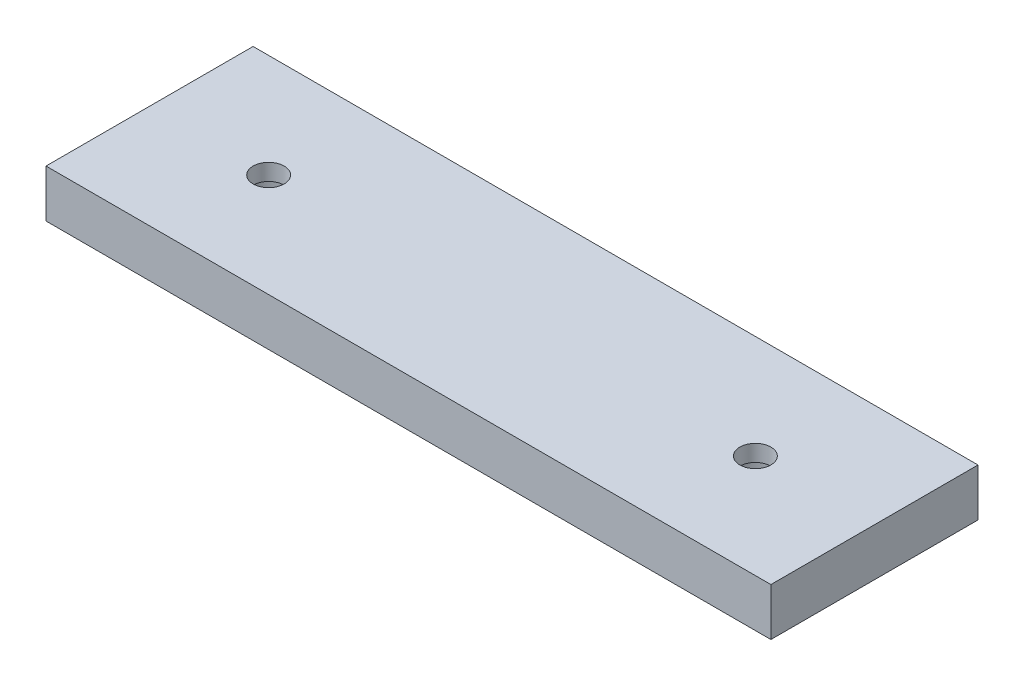
ISO-10303-21;
HEADER;
FILE_DESCRIPTION(('STEP AP214'),'2;1');
FILE_NAME('part.step','',(''),(''),'','','');
FILE_SCHEMA(('AUTOMOTIVE_DESIGN { 1 0 10303 214 1 1 1 1 }'));
ENDSEC;
DATA;
#1=APPLICATION_CONTEXT('core data for automotive mechanical design processes');
#2=APPLICATION_PROTOCOL_DEFINITION('international standard','automotive_design',2000,#1);
#3=PRODUCT_CONTEXT('',#1,'mechanical');
#4=PRODUCT('Part','Part','',(#3));
#5=PRODUCT_RELATED_PRODUCT_CATEGORY('part','',(#4));
#6=PRODUCT_DEFINITION_FORMATION('','',#4);
#7=PRODUCT_DEFINITION_CONTEXT('part definition',#1,'design');
#8=PRODUCT_DEFINITION('design','',#6,#7);
#9=PRODUCT_DEFINITION_SHAPE('','',#8);
#10=(LENGTH_UNIT() NAMED_UNIT(*) SI_UNIT(.MILLI.,.METRE.));
#11=(NAMED_UNIT(*) PLANE_ANGLE_UNIT() SI_UNIT($,.RADIAN.));
#12=(NAMED_UNIT(*) SI_UNIT($,.STERADIAN.) SOLID_ANGLE_UNIT());
#13=UNCERTAINTY_MEASURE_WITH_UNIT(LENGTH_MEASURE(1.E-05),#10,'distance_accuracy_value','');
#14=(GEOMETRIC_REPRESENTATION_CONTEXT(3) GLOBAL_UNCERTAINTY_ASSIGNED_CONTEXT((#13)) GLOBAL_UNIT_ASSIGNED_CONTEXT((#10,
#11,#12)) REPRESENTATION_CONTEXT('',''));
#15=CARTESIAN_POINT('',(0.,0.,0.));
#16=DIRECTION('',(0.,0.,1.));
#17=DIRECTION('',(1.,0.,0.));
#18=AXIS2_PLACEMENT_3D('',#15,#16,#17);
#19=CARTESIAN_POINT('',(11.5,8.8426406871193,-10.));
#20=DIRECTION('',(0.,-1.,0.));
#21=DIRECTION('',(0.,0.,-1.));
#22=AXIS2_PLACEMENT_3D('',#19,#20,#21);
#23=CYLINDRICAL_SURFACE('',#22,1.5);
#24=CARTESIAN_POINT('',(11.5,4.6,-10.));
#25=DIRECTION('',(0.,-1.,0.));
#26=DIRECTION('',(0.,0.,-1.));
#27=AXIS2_PLACEMENT_3D('',#24,#25,#26);
#28=CIRCLE('',#27,1.5);
#29=CARTESIAN_POINT('',(11.5,4.6,-11.5));
#30=VERTEX_POINT('',#29);
#31=EDGE_CURVE('E137',#30,#30,#28,.F.);
#32=ORIENTED_EDGE('',*,*,#31,.T.);
#33=EDGE_LOOP('',(#32));
#34=FACE_BOUND('',#33,.T.);
#35=CARTESIAN_POINT('',(11.5,3.,-10.));
#36=DIRECTION('',(0.,-1.,0.));
#37=DIRECTION('',(0.,0.,-1.));
#38=AXIS2_PLACEMENT_3D('',#35,#36,#37);
#39=CIRCLE('',#38,1.5);
#40=CARTESIAN_POINT('',(11.5,3.,-11.5));
#41=VERTEX_POINT('',#40);
#42=EDGE_CURVE('E46',#41,#41,#39,.F.);
#43=ORIENTED_EDGE('',*,*,#42,.F.);
#44=EDGE_LOOP('',(#43));
#45=FACE_BOUND('',#44,.T.);
#46=ADVANCED_FACE('F42',(#34,#45),#23,.F.);
#47=CARTESIAN_POINT('',(58.5,8.8426406871193,-10.));
#48=DIRECTION('',(0.,-1.,0.));
#49=DIRECTION('',(0.,0.,-1.));
#50=AXIS2_PLACEMENT_3D('',#47,#48,#49);
#51=CYLINDRICAL_SURFACE('',#50,1.5);
#52=CARTESIAN_POINT('',(58.5,4.6,-10.));
#53=DIRECTION('',(0.,-1.,0.));
#54=DIRECTION('',(0.,0.,-1.));
#55=AXIS2_PLACEMENT_3D('',#52,#53,#54);
#56=CIRCLE('',#55,1.5);
#57=CARTESIAN_POINT('',(58.5,4.6,-11.5));
#58=VERTEX_POINT('',#57);
#59=EDGE_CURVE('E118',#58,#58,#56,.F.);
#60=ORIENTED_EDGE('',*,*,#59,.T.);
#61=EDGE_LOOP('',(#60));
#62=FACE_BOUND('',#61,.T.);
#63=CARTESIAN_POINT('',(58.5,3.,-10.));
#64=DIRECTION('',(0.,-1.,0.));
#65=DIRECTION('',(0.,0.,-1.));
#66=AXIS2_PLACEMENT_3D('',#63,#64,#65);
#67=CIRCLE('',#66,1.5);
#68=CARTESIAN_POINT('',(58.5,3.,-11.5));
#69=VERTEX_POINT('',#68);
#70=EDGE_CURVE('E128',#69,#69,#67,.F.);
#71=ORIENTED_EDGE('',*,*,#70,.F.);
#72=EDGE_LOOP('',(#71));
#73=FACE_BOUND('',#72,.T.);
#74=ADVANCED_FACE('F183',(#62,#73),#51,.F.);
#75=CARTESIAN_POINT('',(0.,4.6,0.));
#76=DIRECTION('',(1.,0.,0.));
#77=DIRECTION('',(0.,0.,-1.));
#78=AXIS2_PLACEMENT_3D('',#75,#76,#77);
#79=PLANE('',#78);
#80=DIRECTION('',(0.,0.,1.));
#81=VECTOR('',#80,1.);
#82=CARTESIAN_POINT('',(0.,0.,0.));
#83=LINE('',#82,#81);
#84=CARTESIAN_POINT('',(0.,0.,-20.));
#85=VERTEX_POINT('',#84);
#86=CARTESIAN_POINT('',(0.,0.,0.));
#87=VERTEX_POINT('',#86);
#88=EDGE_CURVE('E114',#85,#87,#83,.T.);
#89=ORIENTED_EDGE('',*,*,#88,.T.);
#90=DIRECTION('',(0.,-1.,0.));
#91=VECTOR('',#90,1.);
#92=CARTESIAN_POINT('',(0.,4.6,0.));
#93=LINE('',#92,#91);
#94=CARTESIAN_POINT('',(0.,4.6,0.));
#95=VERTEX_POINT('',#94);
#96=EDGE_CURVE('E11',#95,#87,#93,.T.);
#97=ORIENTED_EDGE('',*,*,#96,.F.);
#98=DIRECTION('',(0.,0.,1.));
#99=VECTOR('',#98,1.);
#100=CARTESIAN_POINT('',(0.,4.6,0.));
#101=LINE('',#100,#99);
#102=CARTESIAN_POINT('',(0.,4.6,-20.));
#103=VERTEX_POINT('',#102);
#104=EDGE_CURVE('E97',#103,#95,#101,.T.);
#105=ORIENTED_EDGE('',*,*,#104,.F.);
#106=DIRECTION('',(0.,-1.,0.));
#107=VECTOR('',#106,1.);
#108=CARTESIAN_POINT('',(0.,4.6,-20.));
#109=LINE('',#108,#107);
#110=EDGE_CURVE('E110',#103,#85,#109,.T.);
#111=ORIENTED_EDGE('',*,*,#110,.T.);
#112=EDGE_LOOP('',(#89,#97,#105,#111));
#113=FACE_BOUND('',#112,.T.);
#114=ADVANCED_FACE('F44',(#113),#79,.F.);
#115=CARTESIAN_POINT('',(0.,4.6,0.));
#116=DIRECTION('',(0.,0.,-1.));
#117=DIRECTION('',(-1.,0.,0.));
#118=AXIS2_PLACEMENT_3D('',#115,#116,#117);
#119=PLANE('',#118);
#120=DIRECTION('',(1.,0.,0.));
#121=VECTOR('',#120,1.);
#122=CARTESIAN_POINT('',(0.,0.,0.));
#123=LINE('',#122,#121);
#124=CARTESIAN_POINT('',(70.,0.,0.));
#125=VERTEX_POINT('',#124);
#126=EDGE_CURVE('E102',#87,#125,#123,.T.);
#127=ORIENTED_EDGE('',*,*,#126,.T.);
#128=DIRECTION('',(0.,-1.,0.));
#129=VECTOR('',#128,1.);
#130=CARTESIAN_POINT('',(70.,4.6,0.));
#131=LINE('',#130,#129);
#132=CARTESIAN_POINT('',(70.,4.6,0.));
#133=VERTEX_POINT('',#132);
#134=EDGE_CURVE('E53',#133,#125,#131,.T.);
#135=ORIENTED_EDGE('',*,*,#134,.F.);
#136=DIRECTION('',(1.,0.,0.));
#137=VECTOR('',#136,1.);
#138=CARTESIAN_POINT('',(0.,4.6,0.));
#139=LINE('',#138,#137);
#140=EDGE_CURVE('E92',#95,#133,#139,.T.);
#141=ORIENTED_EDGE('',*,*,#140,.F.);
#142=ORIENTED_EDGE('',*,*,#96,.T.);
#143=EDGE_LOOP('',(#127,#135,#141,#142));
#144=FACE_BOUND('',#143,.T.);
#145=ADVANCED_FACE('F101',(#144),#119,.F.);
#146=CARTESIAN_POINT('',(70.,4.6,0.));
#147=DIRECTION('',(-1.,0.,0.));
#148=DIRECTION('',(0.,0.,1.));
#149=AXIS2_PLACEMENT_3D('',#146,#147,#148);
#150=PLANE('',#149);
#151=DIRECTION('',(0.,0.,-1.));
#152=VECTOR('',#151,1.);
#153=CARTESIAN_POINT('',(70.,0.,0.));
#154=LINE('',#153,#152);
#155=CARTESIAN_POINT('',(70.,0.,-20.));
#156=VERTEX_POINT('',#155);
#157=EDGE_CURVE('E79',#125,#156,#154,.T.);
#158=ORIENTED_EDGE('',*,*,#157,.T.);
#159=DIRECTION('',(0.,-1.,0.));
#160=VECTOR('',#159,1.);
#161=CARTESIAN_POINT('',(70.,4.6,-20.));
#162=LINE('',#161,#160);
#163=CARTESIAN_POINT('',(70.,4.6,-20.));
#164=VERTEX_POINT('',#163);
#165=EDGE_CURVE('E104',#164,#156,#162,.T.);
#166=ORIENTED_EDGE('',*,*,#165,.F.);
#167=DIRECTION('',(0.,0.,-1.));
#168=VECTOR('',#167,1.);
#169=CARTESIAN_POINT('',(70.,4.6,0.));
#170=LINE('',#169,#168);
#171=EDGE_CURVE('E95',#133,#164,#170,.T.);
#172=ORIENTED_EDGE('',*,*,#171,.F.);
#173=ORIENTED_EDGE('',*,*,#134,.T.);
#174=EDGE_LOOP('',(#158,#166,#172,#173));
#175=FACE_BOUND('',#174,.T.);
#176=ADVANCED_FACE('F106',(#175),#150,.F.);
#177=CARTESIAN_POINT('',(0.,4.6,-20.));
#178=DIRECTION('',(0.,0.,1.));
#179=DIRECTION('',(1.,0.,0.));
#180=AXIS2_PLACEMENT_3D('',#177,#178,#179);
#181=PLANE('',#180);
#182=DIRECTION('',(-1.,0.,0.));
#183=VECTOR('',#182,1.);
#184=CARTESIAN_POINT('',(0.,0.,-20.));
#185=LINE('',#184,#183);
#186=EDGE_CURVE('E85',#156,#85,#185,.T.);
#187=ORIENTED_EDGE('',*,*,#186,.T.);
#188=ORIENTED_EDGE('',*,*,#110,.F.);
#189=DIRECTION('',(-1.,0.,0.));
#190=VECTOR('',#189,1.);
#191=CARTESIAN_POINT('',(0.,4.6,-20.));
#192=LINE('',#191,#190);
#193=EDGE_CURVE('E62',#164,#103,#192,.T.);
#194=ORIENTED_EDGE('',*,*,#193,.F.);
#195=ORIENTED_EDGE('',*,*,#165,.T.);
#196=EDGE_LOOP('',(#187,#188,#194,#195));
#197=FACE_BOUND('',#196,.T.);
#198=ADVANCED_FACE('F167',(#197),#181,.F.);
#199=CARTESIAN_POINT('',(0.,4.6,0.));
#200=DIRECTION('',(0.,-1.,0.));
#201=DIRECTION('',(0.,0.,-1.));
#202=AXIS2_PLACEMENT_3D('',#199,#200,#201);
#203=PLANE('',#202);
#204=ORIENTED_EDGE('',*,*,#59,.F.);
#205=EDGE_LOOP('',(#204));
#206=FACE_BOUND('',#205,.T.);
#207=ORIENTED_EDGE('',*,*,#31,.F.);
#208=EDGE_LOOP('',(#207));
#209=FACE_BOUND('',#208,.T.);
#210=ORIENTED_EDGE('',*,*,#104,.T.);
#211=ORIENTED_EDGE('',*,*,#140,.T.);
#212=ORIENTED_EDGE('',*,*,#171,.T.);
#213=ORIENTED_EDGE('',*,*,#193,.T.);
#214=EDGE_LOOP('',(#210,#211,#212,#213));
#215=FACE_BOUND('',#214,.T.);
#216=ADVANCED_FACE('F93',(#206,#209,#215),#203,.F.);
#217=CARTESIAN_POINT('',(0.,0.,0.));
#218=DIRECTION('',(0.,-1.,0.));
#219=DIRECTION('',(0.,0.,-1.));
#220=AXIS2_PLACEMENT_3D('',#217,#218,#219);
#221=PLANE('',#220);
#222=CARTESIAN_POINT('',(11.5,0.,-10.));
#223=DIRECTION('',(0.,-1.,0.));
#224=DIRECTION('',(0.,0.,-1.));
#225=AXIS2_PLACEMENT_3D('',#222,#223,#224);
#226=CIRCLE('',#225,3.);
#227=CARTESIAN_POINT('',(11.5,0.,-13.));
#228=VERTEX_POINT('',#227);
#229=EDGE_CURVE('E139',#228,#228,#226,.T.);
#230=ORIENTED_EDGE('',*,*,#229,.F.);
#231=EDGE_LOOP('',(#230));
#232=FACE_BOUND('',#231,.T.);
#233=CARTESIAN_POINT('',(58.5,0.,-10.));
#234=DIRECTION('',(0.,-1.,0.));
#235=DIRECTION('',(0.,0.,-1.));
#236=AXIS2_PLACEMENT_3D('',#233,#234,#235);
#237=CIRCLE('',#236,3.);
#238=CARTESIAN_POINT('',(58.5,0.,-13.));
#239=VERTEX_POINT('',#238);
#240=EDGE_CURVE('E145',#239,#239,#237,.T.);
#241=ORIENTED_EDGE('',*,*,#240,.F.);
#242=EDGE_LOOP('',(#241));
#243=FACE_BOUND('',#242,.T.);
#244=ORIENTED_EDGE('',*,*,#88,.F.);
#245=ORIENTED_EDGE('',*,*,#186,.F.);
#246=ORIENTED_EDGE('',*,*,#157,.F.);
#247=ORIENTED_EDGE('',*,*,#126,.F.);
#248=EDGE_LOOP('',(#244,#245,#246,#247));
#249=FACE_BOUND('',#248,.T.);
#250=ADVANCED_FACE('F166',(#232,#243,#249),#221,.T.);
#251=CARTESIAN_POINT('',(58.5,3.,-10.));
#252=DIRECTION('',(0.,-1.,0.));
#253=DIRECTION('',(0.,0.,-1.));
#254=AXIS2_PLACEMENT_3D('',#251,#252,#253);
#255=PLANE('',#254);
#256=CARTESIAN_POINT('',(58.5,3.,-10.));
#257=DIRECTION('',(0.,-1.,0.));
#258=DIRECTION('',(0.,0.,-1.));
#259=AXIS2_PLACEMENT_3D('',#256,#257,#258);
#260=CIRCLE('',#259,3.);
#261=CARTESIAN_POINT('',(58.5,3.,-13.));
#262=VERTEX_POINT('',#261);
#263=EDGE_CURVE('E151',#262,#262,#260,.T.);
#264=ORIENTED_EDGE('',*,*,#263,.T.);
#265=EDGE_LOOP('',(#264));
#266=FACE_BOUND('',#265,.T.);
#267=ORIENTED_EDGE('',*,*,#70,.T.);
#268=EDGE_LOOP('',(#267));
#269=FACE_BOUND('',#268,.T.);
#270=ADVANCED_FACE('F175',(#266,#269),#255,.T.);
#271=CARTESIAN_POINT('',(58.5,3.,-10.));
#272=DIRECTION('',(0.,-1.,0.));
#273=DIRECTION('',(0.,0.,-1.));
#274=AXIS2_PLACEMENT_3D('',#271,#272,#273);
#275=CYLINDRICAL_SURFACE('',#274,3.);
#276=ORIENTED_EDGE('',*,*,#263,.F.);
#277=EDGE_LOOP('',(#276));
#278=FACE_BOUND('',#277,.T.);
#279=ORIENTED_EDGE('',*,*,#240,.T.);
#280=EDGE_LOOP('',(#279));
#281=FACE_BOUND('',#280,.T.);
#282=ADVANCED_FACE('F192',(#278,#281),#275,.F.);
#283=CARTESIAN_POINT('',(11.5,3.,-10.));
#284=DIRECTION('',(0.,-1.,0.));
#285=DIRECTION('',(0.,0.,-1.));
#286=AXIS2_PLACEMENT_3D('',#283,#284,#285);
#287=PLANE('',#286);
#288=CARTESIAN_POINT('',(11.5,3.,-10.));
#289=DIRECTION('',(0.,-1.,0.));
#290=DIRECTION('',(0.,0.,-1.));
#291=AXIS2_PLACEMENT_3D('',#288,#289,#290);
#292=CIRCLE('',#291,3.);
#293=CARTESIAN_POINT('',(11.5,3.,-13.));
#294=VERTEX_POINT('',#293);
#295=EDGE_CURVE('E131',#294,#294,#292,.T.);
#296=ORIENTED_EDGE('',*,*,#295,.T.);
#297=EDGE_LOOP('',(#296));
#298=FACE_BOUND('',#297,.T.);
#299=ORIENTED_EDGE('',*,*,#42,.T.);
#300=EDGE_LOOP('',(#299));
#301=FACE_BOUND('',#300,.T.);
#302=ADVANCED_FACE('F196',(#298,#301),#287,.T.);
#303=CARTESIAN_POINT('',(11.5,3.,-10.));
#304=DIRECTION('',(0.,-1.,0.));
#305=DIRECTION('',(0.,0.,-1.));
#306=AXIS2_PLACEMENT_3D('',#303,#304,#305);
#307=CYLINDRICAL_SURFACE('',#306,3.);
#308=ORIENTED_EDGE('',*,*,#295,.F.);
#309=EDGE_LOOP('',(#308));
#310=FACE_BOUND('',#309,.T.);
#311=ORIENTED_EDGE('',*,*,#229,.T.);
#312=EDGE_LOOP('',(#311));
#313=FACE_BOUND('',#312,.T.);
#314=ADVANCED_FACE('F198',(#310,#313),#307,.F.);
#315=CLOSED_SHELL('',(#46,#74,#114,#145,#176,#198,#216,#250,#270,#282,#302,#314));
#316=MANIFOLD_SOLID_BREP('B2',#315);
#317=ADVANCED_BREP_SHAPE_REPRESENTATION('',(#18,#316),#14);
#318=SHAPE_DEFINITION_REPRESENTATION(#9,#317);
ENDSEC;
END-ISO-10303-21;
